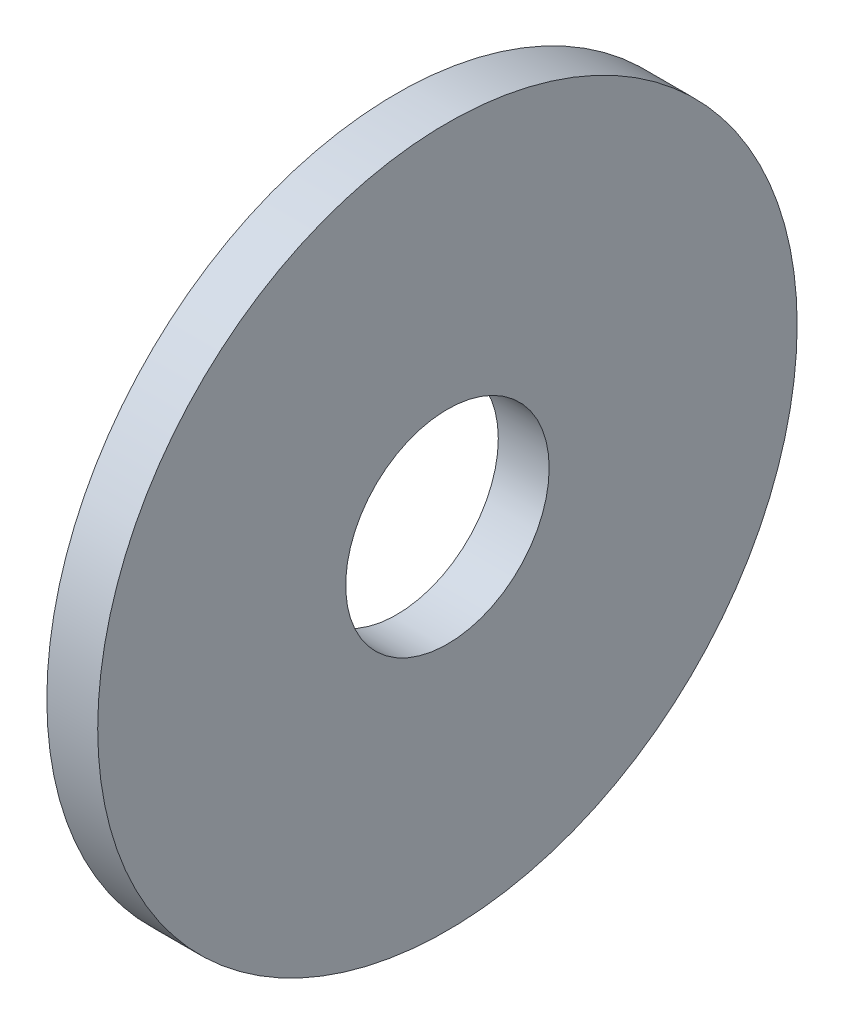
ISO-10303-21;
HEADER;
FILE_DESCRIPTION(('STEP AP214'),'2;1');
FILE_NAME('part.step','',(''),(''),'','','');
FILE_SCHEMA(('AUTOMOTIVE_DESIGN { 1 0 10303 214 1 1 1 1 }'));
ENDSEC;
DATA;
#1=APPLICATION_CONTEXT('core data for automotive mechanical design processes');
#2=APPLICATION_PROTOCOL_DEFINITION('international standard','automotive_design',2000,#1);
#3=PRODUCT_CONTEXT('',#1,'mechanical');
#4=PRODUCT('Part','Part','',(#3));
#5=PRODUCT_RELATED_PRODUCT_CATEGORY('part','',(#4));
#6=PRODUCT_DEFINITION_FORMATION('','',#4);
#7=PRODUCT_DEFINITION_CONTEXT('part definition',#1,'design');
#8=PRODUCT_DEFINITION('design','',#6,#7);
#9=PRODUCT_DEFINITION_SHAPE('','',#8);
#10=(LENGTH_UNIT() NAMED_UNIT(*) SI_UNIT(.MILLI.,.METRE.));
#11=(NAMED_UNIT(*) PLANE_ANGLE_UNIT() SI_UNIT($,.RADIAN.));
#12=(NAMED_UNIT(*) SI_UNIT($,.STERADIAN.) SOLID_ANGLE_UNIT());
#13=UNCERTAINTY_MEASURE_WITH_UNIT(LENGTH_MEASURE(1.E-05),#10,'distance_accuracy_value','');
#14=(GEOMETRIC_REPRESENTATION_CONTEXT(3) GLOBAL_UNCERTAINTY_ASSIGNED_CONTEXT((#13)) GLOBAL_UNIT_ASSIGNED_CONTEXT((#10,
#11,#12)) REPRESENTATION_CONTEXT('',''));
#15=CARTESIAN_POINT('',(0.,0.,0.));
#16=DIRECTION('',(0.,0.,1.));
#17=DIRECTION('',(1.,0.,0.));
#18=AXIS2_PLACEMENT_3D('',#15,#16,#17);
#19=CARTESIAN_POINT('',(0.8,0.,0.));
#20=DIRECTION('',(1.,0.,0.));
#21=DIRECTION('',(0.,0.,-1.));
#22=AXIS2_PLACEMENT_3D('',#19,#20,#21);
#23=PLANE('',#22);
#24=CARTESIAN_POINT('',(0.8,0.,0.));
#25=DIRECTION('',(1.,0.,0.));
#26=DIRECTION('',(0.,0.,-1.));
#27=AXIS2_PLACEMENT_3D('',#24,#25,#26);
#28=CIRCLE('',#27,5.5);
#29=CARTESIAN_POINT('',(0.8,0.,-5.5));
#30=VERTEX_POINT('',#29);
#31=EDGE_CURVE('E10',#30,#30,#28,.T.);
#32=ORIENTED_EDGE('',*,*,#31,.T.);
#33=EDGE_LOOP('',(#32));
#34=FACE_BOUND('',#33,.T.);
#35=CARTESIAN_POINT('',(0.8,0.,0.));
#36=DIRECTION('',(1.,0.,0.));
#37=DIRECTION('',(0.,0.,-1.));
#38=AXIS2_PLACEMENT_3D('',#35,#36,#37);
#39=CIRCLE('',#38,1.6);
#40=CARTESIAN_POINT('',(0.8,0.,-1.6));
#41=VERTEX_POINT('',#40);
#42=EDGE_CURVE('E42',#41,#41,#39,.T.);
#43=ORIENTED_EDGE('',*,*,#42,.F.);
#44=EDGE_LOOP('',(#43));
#45=FACE_BOUND('',#44,.T.);
#46=ADVANCED_FACE('F31',(#34,#45),#23,.T.);
#47=CARTESIAN_POINT('',(0.,0.,0.));
#48=DIRECTION('',(1.,0.,0.));
#49=DIRECTION('',(0.,0.,-1.));
#50=AXIS2_PLACEMENT_3D('',#47,#48,#49);
#51=PLANE('',#50);
#52=CARTESIAN_POINT('',(0.,0.,0.));
#53=DIRECTION('',(1.,0.,0.));
#54=DIRECTION('',(0.,0.,-1.));
#55=AXIS2_PLACEMENT_3D('',#52,#53,#54);
#56=CIRCLE('',#55,5.5);
#57=CARTESIAN_POINT('',(0.,0.,-5.5));
#58=VERTEX_POINT('',#57);
#59=EDGE_CURVE('E35',#58,#58,#56,.T.);
#60=ORIENTED_EDGE('',*,*,#59,.F.);
#61=EDGE_LOOP('',(#60));
#62=FACE_BOUND('',#61,.T.);
#63=CARTESIAN_POINT('',(0.,0.,0.));
#64=DIRECTION('',(1.,0.,0.));
#65=DIRECTION('',(0.,0.,-1.));
#66=AXIS2_PLACEMENT_3D('',#63,#64,#65);
#67=CIRCLE('',#66,1.6);
#68=CARTESIAN_POINT('',(0.,0.,-1.6));
#69=VERTEX_POINT('',#68);
#70=EDGE_CURVE('E44',#69,#69,#67,.T.);
#71=ORIENTED_EDGE('',*,*,#70,.T.);
#72=EDGE_LOOP('',(#71));
#73=FACE_BOUND('',#72,.T.);
#74=ADVANCED_FACE('F54',(#62,#73),#51,.F.);
#75=CARTESIAN_POINT('',(0.8,0.,0.));
#76=DIRECTION('',(-1.,0.,0.));
#77=DIRECTION('',(0.,0.,1.));
#78=AXIS2_PLACEMENT_3D('',#75,#76,#77);
#79=CYLINDRICAL_SURFACE('',#78,5.5);
#80=ORIENTED_EDGE('',*,*,#31,.F.);
#81=EDGE_LOOP('',(#80));
#82=FACE_BOUND('',#81,.T.);
#83=ORIENTED_EDGE('',*,*,#59,.T.);
#84=EDGE_LOOP('',(#83));
#85=FACE_BOUND('',#84,.T.);
#86=ADVANCED_FACE('F33',(#82,#85),#79,.T.);
#87=CARTESIAN_POINT('',(0.8,0.,0.));
#88=DIRECTION('',(-1.,0.,0.));
#89=DIRECTION('',(0.,0.,1.));
#90=AXIS2_PLACEMENT_3D('',#87,#88,#89);
#91=CYLINDRICAL_SURFACE('',#90,1.6);
#92=ORIENTED_EDGE('',*,*,#42,.T.);
#93=EDGE_LOOP('',(#92));
#94=FACE_BOUND('',#93,.T.);
#95=ORIENTED_EDGE('',*,*,#70,.F.);
#96=EDGE_LOOP('',(#95));
#97=FACE_BOUND('',#96,.T.);
#98=ADVANCED_FACE('F50',(#94,#97),#91,.F.);
#99=CLOSED_SHELL('',(#46,#74,#86,#98));
#100=MANIFOLD_SOLID_BREP('B2',#99);
#101=ADVANCED_BREP_SHAPE_REPRESENTATION('',(#18,#100),#14);
#102=SHAPE_DEFINITION_REPRESENTATION(#9,#101);
ENDSEC;
END-ISO-10303-21;
